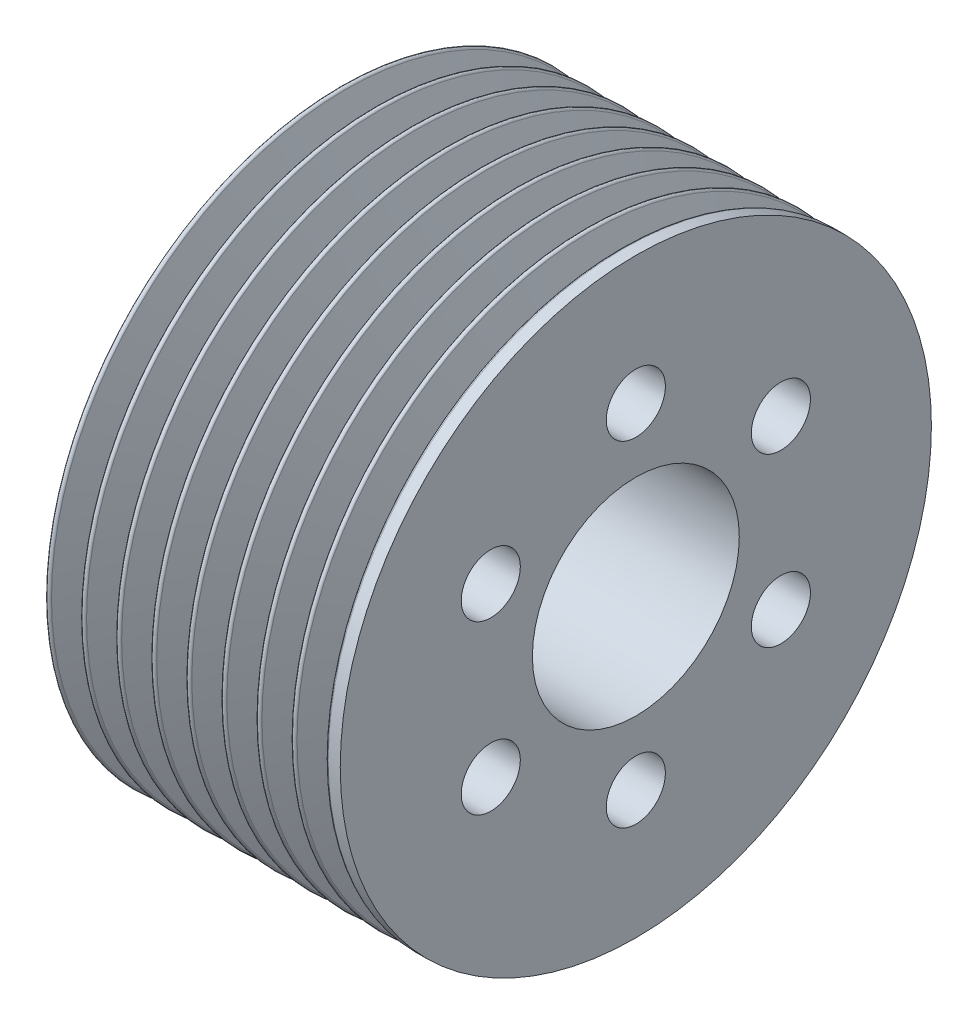
ISO-10303-21;
HEADER;
FILE_DESCRIPTION(('STEP AP214'),'2;1');
FILE_NAME('part.step','',(''),(''),'','','');
FILE_SCHEMA(('AUTOMOTIVE_DESIGN { 1 0 10303 214 1 1 1 1 }'));
ENDSEC;
DATA;
#1=APPLICATION_CONTEXT('core data for automotive mechanical design processes');
#2=APPLICATION_PROTOCOL_DEFINITION('international standard','automotive_design',2000,#1);
#3=PRODUCT_CONTEXT('',#1,'mechanical');
#4=PRODUCT('Part','Part','',(#3));
#5=PRODUCT_RELATED_PRODUCT_CATEGORY('part','',(#4));
#6=PRODUCT_DEFINITION_FORMATION('','',#4);
#7=PRODUCT_DEFINITION_CONTEXT('part definition',#1,'design');
#8=PRODUCT_DEFINITION('design','',#6,#7);
#9=PRODUCT_DEFINITION_SHAPE('','',#8);
#10=(LENGTH_UNIT() NAMED_UNIT(*) SI_UNIT(.MILLI.,.METRE.));
#11=(NAMED_UNIT(*) PLANE_ANGLE_UNIT() SI_UNIT($,.RADIAN.));
#12=(NAMED_UNIT(*) SI_UNIT($,.STERADIAN.) SOLID_ANGLE_UNIT());
#13=UNCERTAINTY_MEASURE_WITH_UNIT(LENGTH_MEASURE(1.E-05),#10,'distance_accuracy_value','');
#14=(GEOMETRIC_REPRESENTATION_CONTEXT(3) GLOBAL_UNCERTAINTY_ASSIGNED_CONTEXT((#13)) GLOBAL_UNIT_ASSIGNED_CONTEXT((#10,
#11,#12)) REPRESENTATION_CONTEXT('',''));
#15=CARTESIAN_POINT('',(0.,0.,0.));
#16=DIRECTION('',(0.,0.,1.));
#17=DIRECTION('',(1.,0.,0.));
#18=AXIS2_PLACEMENT_3D('',#15,#16,#17);
#19=CARTESIAN_POINT('',(18.,30.,0.));
#20=DIRECTION('',(1.,0.,0.));
#21=DIRECTION('',(0.,0.,-1.));
#22=AXIS2_PLACEMENT_3D('',#19,#20,#21);
#23=PLANE('',#22);
#24=CARTESIAN_POINT('',(18.,0.,0.));
#25=DIRECTION('',(-1.,0.,0.));
#26=DIRECTION('',(0.,0.,1.));
#27=AXIS2_PLACEMENT_3D('',#24,#25,#26);
#28=CIRCLE('',#27,21.5);
#29=CARTESIAN_POINT('',(18.,0.,21.5));
#30=VERTEX_POINT('',#29);
#31=EDGE_CURVE('E53',#30,#30,#28,.T.);
#32=ORIENTED_EDGE('',*,*,#31,.F.);
#33=EDGE_LOOP('',(#32));
#34=FACE_BOUND('',#33,.T.);
#35=CARTESIAN_POINT('',(18.,0.,0.));
#36=DIRECTION('',(1.,0.,0.));
#37=DIRECTION('',(0.,0.,-1.));
#38=AXIS2_PLACEMENT_3D('',#35,#36,#37);
#39=CIRCLE('',#38,26.9868547957418);
#40=CARTESIAN_POINT('',(18.,0.,-26.9868547957418));
#41=VERTEX_POINT('',#40);
#42=EDGE_CURVE('E49',#41,#41,#39,.T.);
#43=ORIENTED_EDGE('',*,*,#42,.F.);
#44=EDGE_LOOP('',(#43));
#45=FACE_BOUND('',#44,.T.);
#46=ADVANCED_FACE('F44',(#34,#45),#23,.F.);
#47=CARTESIAN_POINT('',(31.5,10.5,0.));
#48=DIRECTION('',(1.,0.,0.));
#49=DIRECTION('',(0.,0.,-1.));
#50=AXIS2_PLACEMENT_3D('',#47,#48,#49);
#51=PLANE('',#50);
#52=CARTESIAN_POINT('',(31.5,8.50000000000017,14.7224318643354));
#53=DIRECTION('',(1.,0.,0.));
#54=DIRECTION('',(0.,0.,-1.));
#55=AXIS2_PLACEMENT_3D('',#52,#53,#54);
#56=CIRCLE('',#55,3.);
#57=CARTESIAN_POINT('',(31.5,8.50000000000017,11.7224318643354));
#58=VERTEX_POINT('',#57);
#59=EDGE_CURVE('E204',#58,#58,#56,.F.);
#60=ORIENTED_EDGE('',*,*,#59,.F.);
#61=EDGE_LOOP('',(#60));
#62=FACE_BOUND('',#61,.T.);
#63=CARTESIAN_POINT('',(31.5,-8.50000000000004,14.7224318643355));
#64=DIRECTION('',(1.,0.,0.));
#65=DIRECTION('',(0.,0.,-1.));
#66=AXIS2_PLACEMENT_3D('',#63,#64,#65);
#67=CIRCLE('',#66,3.);
#68=CARTESIAN_POINT('',(31.5,-8.50000000000004,11.7224318643355));
#69=VERTEX_POINT('',#68);
#70=EDGE_CURVE('E196',#69,#69,#67,.F.);
#71=ORIENTED_EDGE('',*,*,#70,.F.);
#72=EDGE_LOOP('',(#71));
#73=FACE_BOUND('',#72,.T.);
#74=CARTESIAN_POINT('',(31.5,-17.0000000000001,0.));
#75=DIRECTION('',(1.,0.,0.));
#76=DIRECTION('',(0.,0.,-1.));
#77=AXIS2_PLACEMENT_3D('',#74,#75,#76);
#78=CIRCLE('',#77,3.);
#79=CARTESIAN_POINT('',(31.5,-17.0000000000001,-2.99999999999996));
#80=VERTEX_POINT('',#79);
#81=EDGE_CURVE('E188',#80,#80,#78,.F.);
#82=ORIENTED_EDGE('',*,*,#81,.F.);
#83=EDGE_LOOP('',(#82));
#84=FACE_BOUND('',#83,.T.);
#85=CARTESIAN_POINT('',(31.5,-8.49999999999999,-14.7224318643355));
#86=DIRECTION('',(1.,0.,0.));
#87=DIRECTION('',(0.,0.,-1.));
#88=AXIS2_PLACEMENT_3D('',#85,#86,#87);
#89=CIRCLE('',#88,3.);
#90=CARTESIAN_POINT('',(31.5,-8.49999999999999,-17.7224318643355));
#91=VERTEX_POINT('',#90);
#92=EDGE_CURVE('E182',#91,#91,#89,.F.);
#93=ORIENTED_EDGE('',*,*,#92,.F.);
#94=EDGE_LOOP('',(#93));
#95=FACE_BOUND('',#94,.T.);
#96=CARTESIAN_POINT('',(31.5,8.5,-14.7224318643355));
#97=DIRECTION('',(1.,0.,0.));
#98=DIRECTION('',(0.,0.,-1.));
#99=AXIS2_PLACEMENT_3D('',#96,#97,#98);
#100=CIRCLE('',#99,3.);
#101=CARTESIAN_POINT('',(31.5,8.5,-17.7224318643355));
#102=VERTEX_POINT('',#101);
#103=EDGE_CURVE('E176',#102,#102,#100,.F.);
#104=ORIENTED_EDGE('',*,*,#103,.F.);
#105=EDGE_LOOP('',(#104));
#106=FACE_BOUND('',#105,.T.);
#107=CARTESIAN_POINT('',(31.5,17.,0.));
#108=DIRECTION('',(1.,0.,0.));
#109=DIRECTION('',(0.,0.,-1.));
#110=AXIS2_PLACEMENT_3D('',#107,#108,#109);
#111=CIRCLE('',#110,3.);
#112=CARTESIAN_POINT('',(31.5,17.,-3.));
#113=VERTEX_POINT('',#112);
#114=EDGE_CURVE('E170',#113,#113,#111,.F.);
#115=ORIENTED_EDGE('',*,*,#114,.F.);
#116=EDGE_LOOP('',(#115));
#117=FACE_BOUND('',#116,.T.);
#118=CARTESIAN_POINT('',(31.5,0.,0.));
#119=DIRECTION('',(-1.,0.,0.));
#120=DIRECTION('',(0.,0.,1.));
#121=AXIS2_PLACEMENT_3D('',#118,#119,#120);
#122=CIRCLE('',#121,10.5);
#123=CARTESIAN_POINT('',(31.5,0.,10.5));
#124=VERTEX_POINT('',#123);
#125=EDGE_CURVE('E65',#124,#124,#122,.T.);
#126=ORIENTED_EDGE('',*,*,#125,.F.);
#127=EDGE_LOOP('',(#126));
#128=FACE_BOUND('',#127,.T.);
#129=CARTESIAN_POINT('',(31.5,0.,0.));
#130=DIRECTION('',(-1.,0.,0.));
#131=DIRECTION('',(0.,0.,1.));
#132=AXIS2_PLACEMENT_3D('',#129,#130,#131);
#133=CIRCLE('',#132,21.5);
#134=CARTESIAN_POINT('',(31.5,0.,21.5));
#135=VERTEX_POINT('',#134);
#136=EDGE_CURVE('E10',#135,#135,#133,.T.);
#137=ORIENTED_EDGE('',*,*,#136,.T.);
#138=EDGE_LOOP('',(#137));
#139=FACE_BOUND('',#138,.T.);
#140=ADVANCED_FACE('F47',(#62,#73,#84,#95,#106,#117,#128,#139),#51,.F.);
#141=CARTESIAN_POINT('',(0.,0.,0.));
#142=DIRECTION('',(-1.,0.,0.));
#143=DIRECTION('',(0.,0.,1.));
#144=AXIS2_PLACEMENT_3D('',#141,#142,#143);
#145=CYLINDRICAL_SURFACE('',#144,21.5);
#146=ORIENTED_EDGE('',*,*,#136,.F.);
#147=EDGE_LOOP('',(#146));
#148=FACE_BOUND('',#147,.T.);
#149=ORIENTED_EDGE('',*,*,#31,.T.);
#150=EDGE_LOOP('',(#149));
#151=FACE_BOUND('',#150,.T.);
#152=ADVANCED_FACE('F242',(#148,#151),#145,.F.);
#153=CARTESIAN_POINT('',(0.,0.,0.));
#154=DIRECTION('',(-1.,0.,0.));
#155=DIRECTION('',(0.,0.,1.));
#156=AXIS2_PLACEMENT_3D('',#153,#154,#155);
#157=CYLINDRICAL_SURFACE('',#156,30.);
#158=CARTESIAN_POINT('',(47.78,0.,0.));
#159=DIRECTION('',(-1.,0.,0.));
#160=DIRECTION('',(0.,0.,1.));
#161=AXIS2_PLACEMENT_3D('',#158,#159,#160);
#162=CIRCLE('',#161,30.);
#163=CARTESIAN_POINT('',(47.78,0.,30.));
#164=VERTEX_POINT('',#163);
#165=EDGE_CURVE('E80',#164,#164,#162,.T.);
#166=ORIENTED_EDGE('',*,*,#165,.F.);
#167=EDGE_LOOP('',(#166));
#168=FACE_BOUND('',#167,.T.);
#169=CARTESIAN_POINT('',(49.,0.,0.));
#170=DIRECTION('',(-1.,0.,0.));
#171=DIRECTION('',(0.,0.,1.));
#172=AXIS2_PLACEMENT_3D('',#169,#170,#171);
#173=CIRCLE('',#172,30.);
#174=CARTESIAN_POINT('',(49.,0.,30.));
#175=VERTEX_POINT('',#174);
#176=EDGE_CURVE('E57',#175,#175,#173,.T.);
#177=ORIENTED_EDGE('',*,*,#176,.T.);
#178=EDGE_LOOP('',(#177));
#179=FACE_BOUND('',#178,.T.);
#180=ADVANCED_FACE('F219',(#168,#179),#157,.T.);
#181=CARTESIAN_POINT('',(49.,10.5,0.));
#182=DIRECTION('',(-1.,0.,0.));
#183=DIRECTION('',(0.,0.,1.));
#184=AXIS2_PLACEMENT_3D('',#181,#182,#183);
#185=PLANE('',#184);
#186=CARTESIAN_POINT('',(49.,8.50000000000017,14.7224318643354));
#187=DIRECTION('',(1.,0.,0.));
#188=DIRECTION('',(0.,0.,-1.));
#189=AXIS2_PLACEMENT_3D('',#186,#187,#188);
#190=CIRCLE('',#189,3.);
#191=CARTESIAN_POINT('',(49.,8.50000000000017,11.7224318643354));
#192=VERTEX_POINT('',#191);
#193=EDGE_CURVE('E208',#192,#192,#190,.T.);
#194=ORIENTED_EDGE('',*,*,#193,.F.);
#195=EDGE_LOOP('',(#194));
#196=FACE_BOUND('',#195,.T.);
#197=CARTESIAN_POINT('',(49.,-8.50000000000004,14.7224318643355));
#198=DIRECTION('',(1.,0.,0.));
#199=DIRECTION('',(0.,0.,-1.));
#200=AXIS2_PLACEMENT_3D('',#197,#198,#199);
#201=CIRCLE('',#200,3.);
#202=CARTESIAN_POINT('',(49.,-8.50000000000004,11.7224318643355));
#203=VERTEX_POINT('',#202);
#204=EDGE_CURVE('E200',#203,#203,#201,.T.);
#205=ORIENTED_EDGE('',*,*,#204,.F.);
#206=EDGE_LOOP('',(#205));
#207=FACE_BOUND('',#206,.T.);
#208=CARTESIAN_POINT('',(49.,-17.0000000000001,0.));
#209=DIRECTION('',(1.,0.,0.));
#210=DIRECTION('',(0.,0.,-1.));
#211=AXIS2_PLACEMENT_3D('',#208,#209,#210);
#212=CIRCLE('',#211,3.);
#213=CARTESIAN_POINT('',(49.,-17.0000000000001,-2.99999999999996));
#214=VERTEX_POINT('',#213);
#215=EDGE_CURVE('E192',#214,#214,#212,.T.);
#216=ORIENTED_EDGE('',*,*,#215,.F.);
#217=EDGE_LOOP('',(#216));
#218=FACE_BOUND('',#217,.T.);
#219=CARTESIAN_POINT('',(49.,-8.49999999999999,-14.7224318643355));
#220=DIRECTION('',(1.,0.,0.));
#221=DIRECTION('',(0.,0.,-1.));
#222=AXIS2_PLACEMENT_3D('',#219,#220,#221);
#223=CIRCLE('',#222,3.);
#224=CARTESIAN_POINT('',(49.,-8.49999999999999,-17.7224318643355));
#225=VERTEX_POINT('',#224);
#226=EDGE_CURVE('E185',#225,#225,#223,.T.);
#227=ORIENTED_EDGE('',*,*,#226,.F.);
#228=EDGE_LOOP('',(#227));
#229=FACE_BOUND('',#228,.T.);
#230=CARTESIAN_POINT('',(49.,8.5,-14.7224318643355));
#231=DIRECTION('',(1.,0.,0.));
#232=DIRECTION('',(0.,0.,-1.));
#233=AXIS2_PLACEMENT_3D('',#230,#231,#232);
#234=CIRCLE('',#233,3.);
#235=CARTESIAN_POINT('',(49.,8.5,-17.7224318643355));
#236=VERTEX_POINT('',#235);
#237=EDGE_CURVE('E179',#236,#236,#234,.T.);
#238=ORIENTED_EDGE('',*,*,#237,.F.);
#239=EDGE_LOOP('',(#238));
#240=FACE_BOUND('',#239,.T.);
#241=CARTESIAN_POINT('',(49.,17.,0.));
#242=DIRECTION('',(1.,0.,0.));
#243=DIRECTION('',(0.,0.,-1.));
#244=AXIS2_PLACEMENT_3D('',#241,#242,#243);
#245=CIRCLE('',#244,3.);
#246=CARTESIAN_POINT('',(49.,17.,-3.));
#247=VERTEX_POINT('',#246);
#248=EDGE_CURVE('E173',#247,#247,#245,.T.);
#249=ORIENTED_EDGE('',*,*,#248,.F.);
#250=EDGE_LOOP('',(#249));
#251=FACE_BOUND('',#250,.T.);
#252=ORIENTED_EDGE('',*,*,#176,.F.);
#253=EDGE_LOOP('',(#252));
#254=FACE_BOUND('',#253,.T.);
#255=CARTESIAN_POINT('',(49.,0.,0.));
#256=DIRECTION('',(-1.,0.,0.));
#257=DIRECTION('',(0.,0.,1.));
#258=AXIS2_PLACEMENT_3D('',#255,#256,#257);
#259=CIRCLE('',#258,10.5);
#260=CARTESIAN_POINT('',(49.,0.,10.5));
#261=VERTEX_POINT('',#260);
#262=EDGE_CURVE('E62',#261,#261,#259,.T.);
#263=ORIENTED_EDGE('',*,*,#262,.T.);
#264=EDGE_LOOP('',(#263));
#265=FACE_BOUND('',#264,.T.);
#266=ADVANCED_FACE('F215',(#196,#207,#218,#229,#240,#251,#254,#265),#185,.F.);
#267=CARTESIAN_POINT('',(0.,0.,0.));
#268=DIRECTION('',(-1.,0.,0.));
#269=DIRECTION('',(0.,0.,1.));
#270=AXIS2_PLACEMENT_3D('',#267,#268,#269);
#271=CYLINDRICAL_SURFACE('',#270,10.5);
#272=ORIENTED_EDGE('',*,*,#262,.F.);
#273=EDGE_LOOP('',(#272));
#274=FACE_BOUND('',#273,.T.);
#275=ORIENTED_EDGE('',*,*,#125,.T.);
#276=EDGE_LOOP('',(#275));
#277=FACE_BOUND('',#276,.T.);
#278=ADVANCED_FACE('F218',(#274,#277),#271,.F.);
#279=CARTESIAN_POINT('',(47.78,0.,0.));
#280=DIRECTION('',(-1.,0.,0.));
#281=DIRECTION('',(0.,0.,1.));
#282=AXIS2_PLACEMENT_3D('',#279,#280,#281);
#283=TOROIDAL_SURFACE('',#282,29.75,0.249999999999997);
#284=ORIENTED_EDGE('',*,*,#165,.T.);
#285=EDGE_LOOP('',(#284));
#286=FACE_BOUND('',#285,.T.);
#287=CARTESIAN_POINT('',(47.5458319526879,0.,0.));
#288=DIRECTION('',(-1.,0.,0.));
#289=DIRECTION('',(0.,0.,1.));
#290=AXIS2_PLACEMENT_3D('',#287,#288,#289);
#291=CIRCLE('',#290,29.8375518453149);
#292=CARTESIAN_POINT('',(47.5458319526879,0.,29.8375518453149));
#293=VERTEX_POINT('',#292);
#294=EDGE_CURVE('E68',#293,#293,#291,.T.);
#295=ORIENTED_EDGE('',*,*,#294,.F.);
#296=EDGE_LOOP('',(#295));
#297=FACE_BOUND('',#296,.T.);
#298=ADVANCED_FACE('F237',(#286,#297),#283,.T.);
#299=CARTESIAN_POINT('',(46.2810016567745,0.,0.));
#300=DIRECTION('',(1.,0.,0.));
#301=DIRECTION('',(0.,0.,-1.));
#302=AXIS2_PLACEMENT_3D('',#299,#300,#301);
#303=CONICAL_SURFACE('',#302,26.4546095496951,1.21300383013606);
#304=ORIENTED_EDGE('',*,*,#294,.T.);
#305=EDGE_LOOP('',(#304));
#306=FACE_BOUND('',#305,.T.);
#307=CARTESIAN_POINT('',(46.2810016567745,0.,0.));
#308=DIRECTION('',(-1.,0.,0.));
#309=DIRECTION('',(0.,0.,1.));
#310=AXIS2_PLACEMENT_3D('',#307,#308,#309);
#311=CIRCLE('',#310,26.4546095496951);
#312=CARTESIAN_POINT('',(46.2810016567745,0.,26.4546095496951));
#313=VERTEX_POINT('',#312);
#314=EDGE_CURVE('E71',#313,#313,#311,.T.);
#315=ORIENTED_EDGE('',*,*,#314,.F.);
#316=EDGE_LOOP('',(#315));
#317=FACE_BOUND('',#316,.T.);
#318=ADVANCED_FACE('F403',(#306,#317),#303,.T.);
#319=CARTESIAN_POINT('',(46.,0.,0.));
#320=DIRECTION('',(-1.,0.,0.));
#321=DIRECTION('',(0.,0.,1.));
#322=AXIS2_PLACEMENT_3D('',#319,#320,#321);
#323=TOROIDAL_SURFACE('',#322,26.5596717640729,0.300000000000001);
#324=ORIENTED_EDGE('',*,*,#314,.T.);
#325=EDGE_LOOP('',(#324));
#326=FACE_BOUND('',#325,.T.);
#327=CARTESIAN_POINT('',(45.7189983432255,0.,0.));
#328=DIRECTION('',(-1.,0.,0.));
#329=DIRECTION('',(0.,0.,1.));
#330=AXIS2_PLACEMENT_3D('',#327,#328,#329);
#331=CIRCLE('',#330,26.4546095496951);
#332=CARTESIAN_POINT('',(45.7189983432255,0.,26.4546095496951));
#333=VERTEX_POINT('',#332);
#334=EDGE_CURVE('E74',#333,#333,#331,.T.);
#335=ORIENTED_EDGE('',*,*,#334,.F.);
#336=EDGE_LOOP('',(#335));
#337=FACE_BOUND('',#336,.T.);
#338=ADVANCED_FACE('F399',(#326,#337),#323,.F.);
#339=CARTESIAN_POINT('',(44.4541680473121,0.,0.));
#340=DIRECTION('',(-1.,0.,0.));
#341=DIRECTION('',(0.,0.,1.));
#342=AXIS2_PLACEMENT_3D('',#339,#340,#341);
#343=CONICAL_SURFACE('',#342,29.8375518453149,1.21300383013606);
#344=ORIENTED_EDGE('',*,*,#334,.T.);
#345=EDGE_LOOP('',(#344));
#346=FACE_BOUND('',#345,.T.);
#347=CARTESIAN_POINT('',(44.4541680473121,0.,0.));
#348=DIRECTION('',(-1.,0.,0.));
#349=DIRECTION('',(0.,0.,1.));
#350=AXIS2_PLACEMENT_3D('',#347,#348,#349);
#351=CIRCLE('',#350,29.8375518453149);
#352=CARTESIAN_POINT('',(44.4541680473121,0.,29.8375518453149));
#353=VERTEX_POINT('',#352);
#354=EDGE_CURVE('E77',#353,#353,#351,.T.);
#355=ORIENTED_EDGE('',*,*,#354,.F.);
#356=EDGE_LOOP('',(#355));
#357=FACE_BOUND('',#356,.T.);
#358=ADVANCED_FACE('F395',(#346,#357),#343,.T.);
#359=CARTESIAN_POINT('',(44.22,0.,0.));
#360=DIRECTION('',(-1.,0.,0.));
#361=DIRECTION('',(0.,0.,1.));
#362=AXIS2_PLACEMENT_3D('',#359,#360,#361);
#363=TOROIDAL_SURFACE('',#362,29.75,0.250000000000004);
#364=ORIENTED_EDGE('',*,*,#354,.T.);
#365=EDGE_LOOP('',(#364));
#366=FACE_BOUND('',#365,.T.);
#367=CARTESIAN_POINT('',(43.9858319526879,0.,0.));
#368=DIRECTION('',(-1.,0.,0.));
#369=DIRECTION('',(0.,0.,1.));
#370=AXIS2_PLACEMENT_3D('',#367,#368,#369);
#371=CIRCLE('',#370,29.8375518453149);
#372=CARTESIAN_POINT('',(43.9858319526879,0.,29.8375518453149));
#373=VERTEX_POINT('',#372);
#374=EDGE_CURVE('E83',#373,#373,#371,.T.);
#375=ORIENTED_EDGE('',*,*,#374,.F.);
#376=EDGE_LOOP('',(#375));
#377=FACE_BOUND('',#376,.T.);
#378=ADVANCED_FACE('F391',(#366,#377),#363,.T.);
#379=CARTESIAN_POINT('',(42.7210016567745,0.,0.));
#380=DIRECTION('',(1.,0.,0.));
#381=DIRECTION('',(0.,0.,-1.));
#382=AXIS2_PLACEMENT_3D('',#379,#380,#381);
#383=CONICAL_SURFACE('',#382,26.4546095496951,1.21300383013606);
#384=ORIENTED_EDGE('',*,*,#374,.T.);
#385=EDGE_LOOP('',(#384));
#386=FACE_BOUND('',#385,.T.);
#387=CARTESIAN_POINT('',(42.7210016567745,0.,0.));
#388=DIRECTION('',(-1.,0.,0.));
#389=DIRECTION('',(0.,0.,1.));
#390=AXIS2_PLACEMENT_3D('',#387,#388,#389);
#391=CIRCLE('',#390,26.4546095496951);
#392=CARTESIAN_POINT('',(42.7210016567745,0.,26.4546095496951));
#393=VERTEX_POINT('',#392);
#394=EDGE_CURVE('E86',#393,#393,#391,.T.);
#395=ORIENTED_EDGE('',*,*,#394,.F.);
#396=EDGE_LOOP('',(#395));
#397=FACE_BOUND('',#396,.T.);
#398=ADVANCED_FACE('F387',(#386,#397),#383,.T.);
#399=CARTESIAN_POINT('',(42.44,0.,0.));
#400=DIRECTION('',(-1.,0.,0.));
#401=DIRECTION('',(0.,0.,1.));
#402=AXIS2_PLACEMENT_3D('',#399,#400,#401);
#403=TOROIDAL_SURFACE('',#402,26.5596717640729,0.300000000000001);
#404=ORIENTED_EDGE('',*,*,#394,.T.);
#405=EDGE_LOOP('',(#404));
#406=FACE_BOUND('',#405,.T.);
#407=CARTESIAN_POINT('',(42.1589983432255,0.,0.));
#408=DIRECTION('',(-1.,0.,0.));
#409=DIRECTION('',(0.,0.,1.));
#410=AXIS2_PLACEMENT_3D('',#407,#408,#409);
#411=CIRCLE('',#410,26.4546095496951);
#412=CARTESIAN_POINT('',(42.1589983432255,0.,26.4546095496951));
#413=VERTEX_POINT('',#412);
#414=EDGE_CURVE('E89',#413,#413,#411,.T.);
#415=ORIENTED_EDGE('',*,*,#414,.F.);
#416=EDGE_LOOP('',(#415));
#417=FACE_BOUND('',#416,.T.);
#418=ADVANCED_FACE('F383',(#406,#417),#403,.F.);
#419=CARTESIAN_POINT('',(40.8941680473121,0.,0.));
#420=DIRECTION('',(-1.,0.,0.));
#421=DIRECTION('',(0.,0.,1.));
#422=AXIS2_PLACEMENT_3D('',#419,#420,#421);
#423=CONICAL_SURFACE('',#422,29.8375518453149,1.21300383013606);
#424=ORIENTED_EDGE('',*,*,#414,.T.);
#425=EDGE_LOOP('',(#424));
#426=FACE_BOUND('',#425,.T.);
#427=CARTESIAN_POINT('',(40.8941680473121,0.,0.));
#428=DIRECTION('',(-1.,0.,0.));
#429=DIRECTION('',(0.,0.,1.));
#430=AXIS2_PLACEMENT_3D('',#427,#428,#429);
#431=CIRCLE('',#430,29.8375518453149);
#432=CARTESIAN_POINT('',(40.8941680473121,0.,29.8375518453149));
#433=VERTEX_POINT('',#432);
#434=EDGE_CURVE('E92',#433,#433,#431,.T.);
#435=ORIENTED_EDGE('',*,*,#434,.F.);
#436=EDGE_LOOP('',(#435));
#437=FACE_BOUND('',#436,.T.);
#438=ADVANCED_FACE('F379',(#426,#437),#423,.T.);
#439=CARTESIAN_POINT('',(40.66,0.,0.));
#440=DIRECTION('',(-1.,0.,0.));
#441=DIRECTION('',(0.,0.,1.));
#442=AXIS2_PLACEMENT_3D('',#439,#440,#441);
#443=TOROIDAL_SURFACE('',#442,29.75,0.250000000000004);
#444=ORIENTED_EDGE('',*,*,#434,.T.);
#445=EDGE_LOOP('',(#444));
#446=FACE_BOUND('',#445,.T.);
#447=CARTESIAN_POINT('',(40.4258319526879,0.,0.));
#448=DIRECTION('',(-1.,0.,0.));
#449=DIRECTION('',(0.,0.,1.));
#450=AXIS2_PLACEMENT_3D('',#447,#448,#449);
#451=CIRCLE('',#450,29.8375518453149);
#452=CARTESIAN_POINT('',(40.4258319526879,0.,29.8375518453149));
#453=VERTEX_POINT('',#452);
#454=EDGE_CURVE('E95',#453,#453,#451,.T.);
#455=ORIENTED_EDGE('',*,*,#454,.F.);
#456=EDGE_LOOP('',(#455));
#457=FACE_BOUND('',#456,.T.);
#458=ADVANCED_FACE('F375',(#446,#457),#443,.T.);
#459=CARTESIAN_POINT('',(39.1610016567745,0.,0.));
#460=DIRECTION('',(1.,0.,0.));
#461=DIRECTION('',(0.,0.,-1.));
#462=AXIS2_PLACEMENT_3D('',#459,#460,#461);
#463=CONICAL_SURFACE('',#462,26.4546095496951,1.21300383013606);
#464=ORIENTED_EDGE('',*,*,#454,.T.);
#465=EDGE_LOOP('',(#464));
#466=FACE_BOUND('',#465,.T.);
#467=CARTESIAN_POINT('',(39.1610016567745,0.,0.));
#468=DIRECTION('',(-1.,0.,0.));
#469=DIRECTION('',(0.,0.,1.));
#470=AXIS2_PLACEMENT_3D('',#467,#468,#469);
#471=CIRCLE('',#470,26.4546095496951);
#472=CARTESIAN_POINT('',(39.1610016567745,0.,26.4546095496951));
#473=VERTEX_POINT('',#472);
#474=EDGE_CURVE('E98',#473,#473,#471,.T.);
#475=ORIENTED_EDGE('',*,*,#474,.F.);
#476=EDGE_LOOP('',(#475));
#477=FACE_BOUND('',#476,.T.);
#478=ADVANCED_FACE('F371',(#466,#477),#463,.T.);
#479=CARTESIAN_POINT('',(38.88,0.,0.));
#480=DIRECTION('',(-1.,0.,0.));
#481=DIRECTION('',(0.,0.,1.));
#482=AXIS2_PLACEMENT_3D('',#479,#480,#481);
#483=TOROIDAL_SURFACE('',#482,26.5596717640729,0.300000000000001);
#484=ORIENTED_EDGE('',*,*,#474,.T.);
#485=EDGE_LOOP('',(#484));
#486=FACE_BOUND('',#485,.T.);
#487=CARTESIAN_POINT('',(38.5989983432255,0.,0.));
#488=DIRECTION('',(-1.,0.,0.));
#489=DIRECTION('',(0.,0.,1.));
#490=AXIS2_PLACEMENT_3D('',#487,#488,#489);
#491=CIRCLE('',#490,26.4546095496951);
#492=CARTESIAN_POINT('',(38.5989983432255,0.,26.4546095496951));
#493=VERTEX_POINT('',#492);
#494=EDGE_CURVE('E101',#493,#493,#491,.T.);
#495=ORIENTED_EDGE('',*,*,#494,.F.);
#496=EDGE_LOOP('',(#495));
#497=FACE_BOUND('',#496,.T.);
#498=ADVANCED_FACE('F367',(#486,#497),#483,.F.);
#499=CARTESIAN_POINT('',(37.3341680473121,0.,0.));
#500=DIRECTION('',(-1.,0.,0.));
#501=DIRECTION('',(0.,0.,1.));
#502=AXIS2_PLACEMENT_3D('',#499,#500,#501);
#503=CONICAL_SURFACE('',#502,29.8375518453149,1.21300383013606);
#504=ORIENTED_EDGE('',*,*,#494,.T.);
#505=EDGE_LOOP('',(#504));
#506=FACE_BOUND('',#505,.T.);
#507=CARTESIAN_POINT('',(37.3341680473121,0.,0.));
#508=DIRECTION('',(-1.,0.,0.));
#509=DIRECTION('',(0.,0.,1.));
#510=AXIS2_PLACEMENT_3D('',#507,#508,#509);
#511=CIRCLE('',#510,29.8375518453149);
#512=CARTESIAN_POINT('',(37.3341680473121,0.,29.8375518453149));
#513=VERTEX_POINT('',#512);
#514=EDGE_CURVE('E104',#513,#513,#511,.T.);
#515=ORIENTED_EDGE('',*,*,#514,.F.);
#516=EDGE_LOOP('',(#515));
#517=FACE_BOUND('',#516,.T.);
#518=ADVANCED_FACE('F363',(#506,#517),#503,.T.);
#519=CARTESIAN_POINT('',(37.1,0.,0.));
#520=DIRECTION('',(-1.,0.,0.));
#521=DIRECTION('',(0.,0.,1.));
#522=AXIS2_PLACEMENT_3D('',#519,#520,#521);
#523=TOROIDAL_SURFACE('',#522,29.75,0.250000000000004);
#524=ORIENTED_EDGE('',*,*,#514,.T.);
#525=EDGE_LOOP('',(#524));
#526=FACE_BOUND('',#525,.T.);
#527=CARTESIAN_POINT('',(36.8658319526879,0.,0.));
#528=DIRECTION('',(-1.,0.,0.));
#529=DIRECTION('',(0.,0.,1.));
#530=AXIS2_PLACEMENT_3D('',#527,#528,#529);
#531=CIRCLE('',#530,29.8375518453149);
#532=CARTESIAN_POINT('',(36.8658319526879,0.,29.8375518453149));
#533=VERTEX_POINT('',#532);
#534=EDGE_CURVE('E107',#533,#533,#531,.T.);
#535=ORIENTED_EDGE('',*,*,#534,.F.);
#536=EDGE_LOOP('',(#535));
#537=FACE_BOUND('',#536,.T.);
#538=ADVANCED_FACE('F359',(#526,#537),#523,.T.);
#539=CARTESIAN_POINT('',(35.6010016567745,0.,0.));
#540=DIRECTION('',(1.,0.,0.));
#541=DIRECTION('',(0.,0.,-1.));
#542=AXIS2_PLACEMENT_3D('',#539,#540,#541);
#543=CONICAL_SURFACE('',#542,26.4546095496951,1.21300383013606);
#544=ORIENTED_EDGE('',*,*,#534,.T.);
#545=EDGE_LOOP('',(#544));
#546=FACE_BOUND('',#545,.T.);
#547=CARTESIAN_POINT('',(35.6010016567745,0.,0.));
#548=DIRECTION('',(-1.,0.,0.));
#549=DIRECTION('',(0.,0.,1.));
#550=AXIS2_PLACEMENT_3D('',#547,#548,#549);
#551=CIRCLE('',#550,26.4546095496951);
#552=CARTESIAN_POINT('',(35.6010016567745,0.,26.4546095496951));
#553=VERTEX_POINT('',#552);
#554=EDGE_CURVE('E110',#553,#553,#551,.T.);
#555=ORIENTED_EDGE('',*,*,#554,.F.);
#556=EDGE_LOOP('',(#555));
#557=FACE_BOUND('',#556,.T.);
#558=ADVANCED_FACE('F355',(#546,#557),#543,.T.);
#559=CARTESIAN_POINT('',(35.32,0.,0.));
#560=DIRECTION('',(-1.,0.,0.));
#561=DIRECTION('',(0.,0.,1.));
#562=AXIS2_PLACEMENT_3D('',#559,#560,#561);
#563=TOROIDAL_SURFACE('',#562,26.5596717640729,0.300000000000001);
#564=ORIENTED_EDGE('',*,*,#554,.T.);
#565=EDGE_LOOP('',(#564));
#566=FACE_BOUND('',#565,.T.);
#567=CARTESIAN_POINT('',(35.0389983432255,0.,0.));
#568=DIRECTION('',(-1.,0.,0.));
#569=DIRECTION('',(0.,0.,1.));
#570=AXIS2_PLACEMENT_3D('',#567,#568,#569);
#571=CIRCLE('',#570,26.4546095496951);
#572=CARTESIAN_POINT('',(35.0389983432255,0.,26.4546095496951));
#573=VERTEX_POINT('',#572);
#574=EDGE_CURVE('E113',#573,#573,#571,.T.);
#575=ORIENTED_EDGE('',*,*,#574,.F.);
#576=EDGE_LOOP('',(#575));
#577=FACE_BOUND('',#576,.T.);
#578=ADVANCED_FACE('F351',(#566,#577),#563,.F.);
#579=CARTESIAN_POINT('',(33.7741680473121,0.,0.));
#580=DIRECTION('',(-1.,0.,0.));
#581=DIRECTION('',(0.,0.,1.));
#582=AXIS2_PLACEMENT_3D('',#579,#580,#581);
#583=CONICAL_SURFACE('',#582,29.8375518453149,1.21300383013606);
#584=ORIENTED_EDGE('',*,*,#574,.T.);
#585=EDGE_LOOP('',(#584));
#586=FACE_BOUND('',#585,.T.);
#587=CARTESIAN_POINT('',(33.7741680473121,0.,0.));
#588=DIRECTION('',(-1.,0.,0.));
#589=DIRECTION('',(0.,0.,1.));
#590=AXIS2_PLACEMENT_3D('',#587,#588,#589);
#591=CIRCLE('',#590,29.8375518453149);
#592=CARTESIAN_POINT('',(33.7741680473121,0.,29.8375518453149));
#593=VERTEX_POINT('',#592);
#594=EDGE_CURVE('E116',#593,#593,#591,.T.);
#595=ORIENTED_EDGE('',*,*,#594,.F.);
#596=EDGE_LOOP('',(#595));
#597=FACE_BOUND('',#596,.T.);
#598=ADVANCED_FACE('F347',(#586,#597),#583,.T.);
#599=CARTESIAN_POINT('',(33.54,0.,0.));
#600=DIRECTION('',(-1.,0.,0.));
#601=DIRECTION('',(0.,0.,1.));
#602=AXIS2_PLACEMENT_3D('',#599,#600,#601);
#603=TOROIDAL_SURFACE('',#602,29.75,0.250000000000004);
#604=ORIENTED_EDGE('',*,*,#594,.T.);
#605=EDGE_LOOP('',(#604));
#606=FACE_BOUND('',#605,.T.);
#607=CARTESIAN_POINT('',(33.3058319526879,0.,0.));
#608=DIRECTION('',(-1.,0.,0.));
#609=DIRECTION('',(0.,0.,1.));
#610=AXIS2_PLACEMENT_3D('',#607,#608,#609);
#611=CIRCLE('',#610,29.8375518453149);
#612=CARTESIAN_POINT('',(33.3058319526879,0.,29.8375518453149));
#613=VERTEX_POINT('',#612);
#614=EDGE_CURVE('E119',#613,#613,#611,.T.);
#615=ORIENTED_EDGE('',*,*,#614,.F.);
#616=EDGE_LOOP('',(#615));
#617=FACE_BOUND('',#616,.T.);
#618=ADVANCED_FACE('F343',(#606,#617),#603,.T.);
#619=CARTESIAN_POINT('',(32.0410016567745,0.,0.));
#620=DIRECTION('',(1.,0.,0.));
#621=DIRECTION('',(0.,0.,-1.));
#622=AXIS2_PLACEMENT_3D('',#619,#620,#621);
#623=CONICAL_SURFACE('',#622,26.4546095496951,1.21300383013606);
#624=ORIENTED_EDGE('',*,*,#614,.T.);
#625=EDGE_LOOP('',(#624));
#626=FACE_BOUND('',#625,.T.);
#627=CARTESIAN_POINT('',(32.0410016567745,0.,0.));
#628=DIRECTION('',(-1.,0.,0.));
#629=DIRECTION('',(0.,0.,1.));
#630=AXIS2_PLACEMENT_3D('',#627,#628,#629);
#631=CIRCLE('',#630,26.4546095496951);
#632=CARTESIAN_POINT('',(32.0410016567745,0.,26.4546095496951));
#633=VERTEX_POINT('',#632);
#634=EDGE_CURVE('E122',#633,#633,#631,.T.);
#635=ORIENTED_EDGE('',*,*,#634,.F.);
#636=EDGE_LOOP('',(#635));
#637=FACE_BOUND('',#636,.T.);
#638=ADVANCED_FACE('F339',(#626,#637),#623,.T.);
#639=CARTESIAN_POINT('',(31.76,0.,0.));
#640=DIRECTION('',(-1.,0.,0.));
#641=DIRECTION('',(0.,0.,1.));
#642=AXIS2_PLACEMENT_3D('',#639,#640,#641);
#643=TOROIDAL_SURFACE('',#642,26.5596717640729,0.300000000000001);
#644=ORIENTED_EDGE('',*,*,#634,.T.);
#645=EDGE_LOOP('',(#644));
#646=FACE_BOUND('',#645,.T.);
#647=CARTESIAN_POINT('',(31.4789983432255,0.,0.));
#648=DIRECTION('',(-1.,0.,0.));
#649=DIRECTION('',(0.,0.,1.));
#650=AXIS2_PLACEMENT_3D('',#647,#648,#649);
#651=CIRCLE('',#650,26.4546095496951);
#652=CARTESIAN_POINT('',(31.4789983432255,0.,26.4546095496951));
#653=VERTEX_POINT('',#652);
#654=EDGE_CURVE('E125',#653,#653,#651,.T.);
#655=ORIENTED_EDGE('',*,*,#654,.F.);
#656=EDGE_LOOP('',(#655));
#657=FACE_BOUND('',#656,.T.);
#658=ADVANCED_FACE('F335',(#646,#657),#643,.F.);
#659=CARTESIAN_POINT('',(30.2141680473121,0.,0.));
#660=DIRECTION('',(-1.,0.,0.));
#661=DIRECTION('',(0.,0.,1.));
#662=AXIS2_PLACEMENT_3D('',#659,#660,#661);
#663=CONICAL_SURFACE('',#662,29.8375518453149,1.21300383013606);
#664=ORIENTED_EDGE('',*,*,#654,.T.);
#665=EDGE_LOOP('',(#664));
#666=FACE_BOUND('',#665,.T.);
#667=CARTESIAN_POINT('',(30.2141680473121,0.,0.));
#668=DIRECTION('',(-1.,0.,0.));
#669=DIRECTION('',(0.,0.,1.));
#670=AXIS2_PLACEMENT_3D('',#667,#668,#669);
#671=CIRCLE('',#670,29.8375518453149);
#672=CARTESIAN_POINT('',(30.2141680473121,0.,29.8375518453149));
#673=VERTEX_POINT('',#672);
#674=EDGE_CURVE('E128',#673,#673,#671,.T.);
#675=ORIENTED_EDGE('',*,*,#674,.F.);
#676=EDGE_LOOP('',(#675));
#677=FACE_BOUND('',#676,.T.);
#678=ADVANCED_FACE('F331',(#666,#677),#663,.T.);
#679=CARTESIAN_POINT('',(29.98,0.,0.));
#680=DIRECTION('',(-1.,0.,0.));
#681=DIRECTION('',(0.,0.,1.));
#682=AXIS2_PLACEMENT_3D('',#679,#680,#681);
#683=TOROIDAL_SURFACE('',#682,29.75,0.250000000000004);
#684=ORIENTED_EDGE('',*,*,#674,.T.);
#685=EDGE_LOOP('',(#684));
#686=FACE_BOUND('',#685,.T.);
#687=CARTESIAN_POINT('',(29.7458319526879,0.,0.));
#688=DIRECTION('',(-1.,0.,0.));
#689=DIRECTION('',(0.,0.,1.));
#690=AXIS2_PLACEMENT_3D('',#687,#688,#689);
#691=CIRCLE('',#690,29.8375518453149);
#692=CARTESIAN_POINT('',(29.7458319526879,0.,29.8375518453149));
#693=VERTEX_POINT('',#692);
#694=EDGE_CURVE('E131',#693,#693,#691,.T.);
#695=ORIENTED_EDGE('',*,*,#694,.F.);
#696=EDGE_LOOP('',(#695));
#697=FACE_BOUND('',#696,.T.);
#698=ADVANCED_FACE('F327',(#686,#697),#683,.T.);
#699=CARTESIAN_POINT('',(28.4810016567745,0.,0.));
#700=DIRECTION('',(1.,0.,0.));
#701=DIRECTION('',(0.,0.,-1.));
#702=AXIS2_PLACEMENT_3D('',#699,#700,#701);
#703=CONICAL_SURFACE('',#702,26.4546095496951,1.21300383013606);
#704=ORIENTED_EDGE('',*,*,#694,.T.);
#705=EDGE_LOOP('',(#704));
#706=FACE_BOUND('',#705,.T.);
#707=CARTESIAN_POINT('',(28.4810016567745,0.,0.));
#708=DIRECTION('',(-1.,0.,0.));
#709=DIRECTION('',(0.,0.,1.));
#710=AXIS2_PLACEMENT_3D('',#707,#708,#709);
#711=CIRCLE('',#710,26.4546095496951);
#712=CARTESIAN_POINT('',(28.4810016567745,0.,26.4546095496951));
#713=VERTEX_POINT('',#712);
#714=EDGE_CURVE('E134',#713,#713,#711,.T.);
#715=ORIENTED_EDGE('',*,*,#714,.F.);
#716=EDGE_LOOP('',(#715));
#717=FACE_BOUND('',#716,.T.);
#718=ADVANCED_FACE('F323',(#706,#717),#703,.T.);
#719=CARTESIAN_POINT('',(28.2,0.,0.));
#720=DIRECTION('',(-1.,0.,0.));
#721=DIRECTION('',(0.,0.,1.));
#722=AXIS2_PLACEMENT_3D('',#719,#720,#721);
#723=TOROIDAL_SURFACE('',#722,26.5596717640729,0.300000000000001);
#724=ORIENTED_EDGE('',*,*,#714,.T.);
#725=EDGE_LOOP('',(#724));
#726=FACE_BOUND('',#725,.T.);
#727=CARTESIAN_POINT('',(27.9189983432255,0.,0.));
#728=DIRECTION('',(-1.,0.,0.));
#729=DIRECTION('',(0.,0.,1.));
#730=AXIS2_PLACEMENT_3D('',#727,#728,#729);
#731=CIRCLE('',#730,26.4546095496951);
#732=CARTESIAN_POINT('',(27.9189983432255,0.,26.4546095496951));
#733=VERTEX_POINT('',#732);
#734=EDGE_CURVE('E137',#733,#733,#731,.T.);
#735=ORIENTED_EDGE('',*,*,#734,.F.);
#736=EDGE_LOOP('',(#735));
#737=FACE_BOUND('',#736,.T.);
#738=ADVANCED_FACE('F319',(#726,#737),#723,.F.);
#739=CARTESIAN_POINT('',(26.6541680473121,0.,0.));
#740=DIRECTION('',(-1.,0.,0.));
#741=DIRECTION('',(0.,0.,1.));
#742=AXIS2_PLACEMENT_3D('',#739,#740,#741);
#743=CONICAL_SURFACE('',#742,29.8375518453149,1.21300383013606);
#744=ORIENTED_EDGE('',*,*,#734,.T.);
#745=EDGE_LOOP('',(#744));
#746=FACE_BOUND('',#745,.T.);
#747=CARTESIAN_POINT('',(26.6541680473121,0.,0.));
#748=DIRECTION('',(-1.,0.,0.));
#749=DIRECTION('',(0.,0.,1.));
#750=AXIS2_PLACEMENT_3D('',#747,#748,#749);
#751=CIRCLE('',#750,29.8375518453149);
#752=CARTESIAN_POINT('',(26.6541680473121,0.,29.8375518453149));
#753=VERTEX_POINT('',#752);
#754=EDGE_CURVE('E140',#753,#753,#751,.T.);
#755=ORIENTED_EDGE('',*,*,#754,.F.);
#756=EDGE_LOOP('',(#755));
#757=FACE_BOUND('',#756,.T.);
#758=ADVANCED_FACE('F315',(#746,#757),#743,.T.);
#759=CARTESIAN_POINT('',(26.42,0.,0.));
#760=DIRECTION('',(-1.,0.,0.));
#761=DIRECTION('',(0.,0.,1.));
#762=AXIS2_PLACEMENT_3D('',#759,#760,#761);
#763=TOROIDAL_SURFACE('',#762,29.75,0.250000000000004);
#764=ORIENTED_EDGE('',*,*,#754,.T.);
#765=EDGE_LOOP('',(#764));
#766=FACE_BOUND('',#765,.T.);
#767=CARTESIAN_POINT('',(26.1858319526879,0.,0.));
#768=DIRECTION('',(-1.,0.,0.));
#769=DIRECTION('',(0.,0.,1.));
#770=AXIS2_PLACEMENT_3D('',#767,#768,#769);
#771=CIRCLE('',#770,29.8375518453149);
#772=CARTESIAN_POINT('',(26.1858319526879,0.,29.8375518453149));
#773=VERTEX_POINT('',#772);
#774=EDGE_CURVE('E143',#773,#773,#771,.T.);
#775=ORIENTED_EDGE('',*,*,#774,.F.);
#776=EDGE_LOOP('',(#775));
#777=FACE_BOUND('',#776,.T.);
#778=ADVANCED_FACE('F311',(#766,#777),#763,.T.);
#779=CARTESIAN_POINT('',(24.9210016567745,0.,0.));
#780=DIRECTION('',(1.,0.,0.));
#781=DIRECTION('',(0.,0.,-1.));
#782=AXIS2_PLACEMENT_3D('',#779,#780,#781);
#783=CONICAL_SURFACE('',#782,26.4546095496951,1.21300383013606);
#784=ORIENTED_EDGE('',*,*,#774,.T.);
#785=EDGE_LOOP('',(#784));
#786=FACE_BOUND('',#785,.T.);
#787=CARTESIAN_POINT('',(24.9210016567745,0.,0.));
#788=DIRECTION('',(-1.,0.,0.));
#789=DIRECTION('',(0.,0.,1.));
#790=AXIS2_PLACEMENT_3D('',#787,#788,#789);
#791=CIRCLE('',#790,26.4546095496951);
#792=CARTESIAN_POINT('',(24.9210016567745,0.,26.4546095496951));
#793=VERTEX_POINT('',#792);
#794=EDGE_CURVE('E146',#793,#793,#791,.T.);
#795=ORIENTED_EDGE('',*,*,#794,.F.);
#796=EDGE_LOOP('',(#795));
#797=FACE_BOUND('',#796,.T.);
#798=ADVANCED_FACE('F307',(#786,#797),#783,.T.);
#799=CARTESIAN_POINT('',(24.64,0.,0.));
#800=DIRECTION('',(-1.,0.,0.));
#801=DIRECTION('',(0.,0.,1.));
#802=AXIS2_PLACEMENT_3D('',#799,#800,#801);
#803=TOROIDAL_SURFACE('',#802,26.5596717640729,0.300000000000001);
#804=ORIENTED_EDGE('',*,*,#794,.T.);
#805=EDGE_LOOP('',(#804));
#806=FACE_BOUND('',#805,.T.);
#807=CARTESIAN_POINT('',(24.3589983432255,0.,0.));
#808=DIRECTION('',(-1.,0.,0.));
#809=DIRECTION('',(0.,0.,1.));
#810=AXIS2_PLACEMENT_3D('',#807,#808,#809);
#811=CIRCLE('',#810,26.4546095496951);
#812=CARTESIAN_POINT('',(24.3589983432255,0.,26.4546095496951));
#813=VERTEX_POINT('',#812);
#814=EDGE_CURVE('E149',#813,#813,#811,.T.);
#815=ORIENTED_EDGE('',*,*,#814,.F.);
#816=EDGE_LOOP('',(#815));
#817=FACE_BOUND('',#816,.T.);
#818=ADVANCED_FACE('F303',(#806,#817),#803,.F.);
#819=CARTESIAN_POINT('',(23.0941680473121,0.,0.));
#820=DIRECTION('',(-1.,0.,0.));
#821=DIRECTION('',(0.,0.,1.));
#822=AXIS2_PLACEMENT_3D('',#819,#820,#821);
#823=CONICAL_SURFACE('',#822,29.8375518453149,1.21300383013606);
#824=ORIENTED_EDGE('',*,*,#814,.T.);
#825=EDGE_LOOP('',(#824));
#826=FACE_BOUND('',#825,.T.);
#827=CARTESIAN_POINT('',(23.0941680473121,0.,0.));
#828=DIRECTION('',(-1.,0.,0.));
#829=DIRECTION('',(0.,0.,1.));
#830=AXIS2_PLACEMENT_3D('',#827,#828,#829);
#831=CIRCLE('',#830,29.8375518453149);
#832=CARTESIAN_POINT('',(23.0941680473121,0.,29.8375518453149));
#833=VERTEX_POINT('',#832);
#834=EDGE_CURVE('E152',#833,#833,#831,.T.);
#835=ORIENTED_EDGE('',*,*,#834,.F.);
#836=EDGE_LOOP('',(#835));
#837=FACE_BOUND('',#836,.T.);
#838=ADVANCED_FACE('F299',(#826,#837),#823,.T.);
#839=CARTESIAN_POINT('',(22.86,0.,0.));
#840=DIRECTION('',(-1.,0.,0.));
#841=DIRECTION('',(0.,0.,1.));
#842=AXIS2_PLACEMENT_3D('',#839,#840,#841);
#843=TOROIDAL_SURFACE('',#842,29.75,0.250000000000004);
#844=ORIENTED_EDGE('',*,*,#834,.T.);
#845=EDGE_LOOP('',(#844));
#846=FACE_BOUND('',#845,.T.);
#847=CARTESIAN_POINT('',(22.6258319526879,0.,0.));
#848=DIRECTION('',(-1.,0.,0.));
#849=DIRECTION('',(0.,0.,1.));
#850=AXIS2_PLACEMENT_3D('',#847,#848,#849);
#851=CIRCLE('',#850,29.8375518453149);
#852=CARTESIAN_POINT('',(22.6258319526879,0.,29.8375518453149));
#853=VERTEX_POINT('',#852);
#854=EDGE_CURVE('E155',#853,#853,#851,.T.);
#855=ORIENTED_EDGE('',*,*,#854,.F.);
#856=EDGE_LOOP('',(#855));
#857=FACE_BOUND('',#856,.T.);
#858=ADVANCED_FACE('F295',(#846,#857),#843,.T.);
#859=CARTESIAN_POINT('',(21.3610016567745,0.,0.));
#860=DIRECTION('',(1.,0.,0.));
#861=DIRECTION('',(0.,0.,-1.));
#862=AXIS2_PLACEMENT_3D('',#859,#860,#861);
#863=CONICAL_SURFACE('',#862,26.4546095496951,1.21300383013606);
#864=ORIENTED_EDGE('',*,*,#854,.T.);
#865=EDGE_LOOP('',(#864));
#866=FACE_BOUND('',#865,.T.);
#867=CARTESIAN_POINT('',(21.3610016567745,0.,0.));
#868=DIRECTION('',(-1.,0.,0.));
#869=DIRECTION('',(0.,0.,1.));
#870=AXIS2_PLACEMENT_3D('',#867,#868,#869);
#871=CIRCLE('',#870,26.4546095496951);
#872=CARTESIAN_POINT('',(21.3610016567745,0.,26.4546095496951));
#873=VERTEX_POINT('',#872);
#874=EDGE_CURVE('E158',#873,#873,#871,.T.);
#875=ORIENTED_EDGE('',*,*,#874,.F.);
#876=EDGE_LOOP('',(#875));
#877=FACE_BOUND('',#876,.T.);
#878=ADVANCED_FACE('F291',(#866,#877),#863,.T.);
#879=CARTESIAN_POINT('',(21.08,0.,0.));
#880=DIRECTION('',(-1.,0.,0.));
#881=DIRECTION('',(0.,0.,1.));
#882=AXIS2_PLACEMENT_3D('',#879,#880,#881);
#883=TOROIDAL_SURFACE('',#882,26.5596717640729,0.300000000000001);
#884=ORIENTED_EDGE('',*,*,#874,.T.);
#885=EDGE_LOOP('',(#884));
#886=FACE_BOUND('',#885,.T.);
#887=CARTESIAN_POINT('',(20.7989983432255,0.,0.));
#888=DIRECTION('',(-1.,0.,0.));
#889=DIRECTION('',(0.,0.,1.));
#890=AXIS2_PLACEMENT_3D('',#887,#888,#889);
#891=CIRCLE('',#890,26.4546095496951);
#892=CARTESIAN_POINT('',(20.7989983432255,0.,26.4546095496951));
#893=VERTEX_POINT('',#892);
#894=EDGE_CURVE('E161',#893,#893,#891,.T.);
#895=ORIENTED_EDGE('',*,*,#894,.F.);
#896=EDGE_LOOP('',(#895));
#897=FACE_BOUND('',#896,.T.);
#898=ADVANCED_FACE('F287',(#886,#897),#883,.F.);
#899=CARTESIAN_POINT('',(19.5341680473121,0.,0.));
#900=DIRECTION('',(-1.,0.,0.));
#901=DIRECTION('',(0.,0.,1.));
#902=AXIS2_PLACEMENT_3D('',#899,#900,#901);
#903=CONICAL_SURFACE('',#902,29.8375518453149,1.21300383013606);
#904=ORIENTED_EDGE('',*,*,#894,.T.);
#905=EDGE_LOOP('',(#904));
#906=FACE_BOUND('',#905,.T.);
#907=CARTESIAN_POINT('',(19.5341680473121,0.,0.));
#908=DIRECTION('',(-1.,0.,0.));
#909=DIRECTION('',(0.,0.,1.));
#910=AXIS2_PLACEMENT_3D('',#907,#908,#909);
#911=CIRCLE('',#910,29.8375518453149);
#912=CARTESIAN_POINT('',(19.5341680473121,0.,29.8375518453149));
#913=VERTEX_POINT('',#912);
#914=EDGE_CURVE('E164',#913,#913,#911,.T.);
#915=ORIENTED_EDGE('',*,*,#914,.F.);
#916=EDGE_LOOP('',(#915));
#917=FACE_BOUND('',#916,.T.);
#918=ADVANCED_FACE('F283',(#906,#917),#903,.T.);
#919=CARTESIAN_POINT('',(19.3,0.,0.));
#920=DIRECTION('',(-1.,0.,0.));
#921=DIRECTION('',(0.,0.,1.));
#922=AXIS2_PLACEMENT_3D('',#919,#920,#921);
#923=TOROIDAL_SURFACE('',#922,29.75,0.250000000000004);
#924=ORIENTED_EDGE('',*,*,#914,.T.);
#925=EDGE_LOOP('',(#924));
#926=FACE_BOUND('',#925,.T.);
#927=CARTESIAN_POINT('',(19.0658319526879,0.,0.));
#928=DIRECTION('',(-1.,0.,0.));
#929=DIRECTION('',(0.,0.,1.));
#930=AXIS2_PLACEMENT_3D('',#927,#928,#929);
#931=CIRCLE('',#930,29.8375518453149);
#932=CARTESIAN_POINT('',(19.0658319526879,0.,29.8375518453149));
#933=VERTEX_POINT('',#932);
#934=EDGE_CURVE('E167',#933,#933,#931,.T.);
#935=ORIENTED_EDGE('',*,*,#934,.F.);
#936=EDGE_LOOP('',(#935));
#937=FACE_BOUND('',#936,.T.);
#938=ADVANCED_FACE('F276',(#926,#937),#923,.T.);
#939=CARTESIAN_POINT('',(17.8010016567745,0.,0.));
#940=DIRECTION('',(1.,0.,0.));
#941=DIRECTION('',(0.,0.,-1.));
#942=AXIS2_PLACEMENT_3D('',#939,#940,#941);
#943=CONICAL_SURFACE('',#942,26.4546095496951,1.21300383013606);
#944=ORIENTED_EDGE('',*,*,#934,.T.);
#945=EDGE_LOOP('',(#944));
#946=FACE_BOUND('',#945,.T.);
#947=ORIENTED_EDGE('',*,*,#42,.T.);
#948=EDGE_LOOP('',(#947));
#949=FACE_BOUND('',#948,.T.);
#950=ADVANCED_FACE('F267',(#946,#949),#943,.T.);
#951=CARTESIAN_POINT('',(23.0147186257614,17.,0.));
#952=DIRECTION('',(1.,0.,0.));
#953=DIRECTION('',(0.,0.,-1.));
#954=AXIS2_PLACEMENT_3D('',#951,#952,#953);
#955=CYLINDRICAL_SURFACE('',#954,3.);
#956=ORIENTED_EDGE('',*,*,#114,.T.);
#957=EDGE_LOOP('',(#956));
#958=FACE_BOUND('',#957,.T.);
#959=ORIENTED_EDGE('',*,*,#248,.T.);
#960=EDGE_LOOP('',(#959));
#961=FACE_BOUND('',#960,.T.);
#962=ADVANCED_FACE('F263',(#958,#961),#955,.F.);
#963=CARTESIAN_POINT('',(23.0147186257614,8.5,-14.7224318643355));
#964=DIRECTION('',(1.,0.,0.));
#965=DIRECTION('',(0.,0.,-1.));
#966=AXIS2_PLACEMENT_3D('',#963,#964,#965);
#967=CYLINDRICAL_SURFACE('',#966,3.);
#968=ORIENTED_EDGE('',*,*,#103,.T.);
#969=EDGE_LOOP('',(#968));
#970=FACE_BOUND('',#969,.T.);
#971=ORIENTED_EDGE('',*,*,#237,.T.);
#972=EDGE_LOOP('',(#971));
#973=FACE_BOUND('',#972,.T.);
#974=ADVANCED_FACE('F266',(#970,#973),#967,.F.);
#975=CARTESIAN_POINT('',(23.0147186257614,-8.49999999999999,-14.7224318643355));
#976=DIRECTION('',(1.,0.,0.));
#977=DIRECTION('',(0.,0.,-1.));
#978=AXIS2_PLACEMENT_3D('',#975,#976,#977);
#979=CYLINDRICAL_SURFACE('',#978,3.);
#980=ORIENTED_EDGE('',*,*,#92,.T.);
#981=EDGE_LOOP('',(#980));
#982=FACE_BOUND('',#981,.T.);
#983=ORIENTED_EDGE('',*,*,#226,.T.);
#984=EDGE_LOOP('',(#983));
#985=FACE_BOUND('',#984,.T.);
#986=ADVANCED_FACE('F273',(#982,#985),#979,.F.);
#987=CARTESIAN_POINT('',(23.0147186257614,-17.0000000000001,0.));
#988=DIRECTION('',(1.,0.,0.));
#989=DIRECTION('',(0.,0.,-1.));
#990=AXIS2_PLACEMENT_3D('',#987,#988,#989);
#991=CYLINDRICAL_SURFACE('',#990,3.);
#992=ORIENTED_EDGE('',*,*,#81,.T.);
#993=EDGE_LOOP('',(#992));
#994=FACE_BOUND('',#993,.T.);
#995=ORIENTED_EDGE('',*,*,#215,.T.);
#996=EDGE_LOOP('',(#995));
#997=FACE_BOUND('',#996,.T.);
#998=ADVANCED_FACE('F614',(#994,#997),#991,.F.);
#999=CARTESIAN_POINT('',(23.0147186257614,-8.50000000000004,14.7224318643355));
#1000=DIRECTION('',(1.,0.,0.));
#1001=DIRECTION('',(0.,0.,-1.));
#1002=AXIS2_PLACEMENT_3D('',#999,#1000,#1001);
#1003=CYLINDRICAL_SURFACE('',#1002,3.);
#1004=ORIENTED_EDGE('',*,*,#70,.T.);
#1005=EDGE_LOOP('',(#1004));
#1006=FACE_BOUND('',#1005,.T.);
#1007=ORIENTED_EDGE('',*,*,#204,.T.);
#1008=EDGE_LOOP('',(#1007));
#1009=FACE_BOUND('',#1008,.T.);
#1010=ADVANCED_FACE('F622',(#1006,#1009),#1003,.F.);
#1011=CARTESIAN_POINT('',(23.0147186257614,8.50000000000017,14.7224318643354));
#1012=DIRECTION('',(1.,0.,0.));
#1013=DIRECTION('',(0.,0.,-1.));
#1014=AXIS2_PLACEMENT_3D('',#1011,#1012,#1013);
#1015=CYLINDRICAL_SURFACE('',#1014,3.);
#1016=ORIENTED_EDGE('',*,*,#59,.T.);
#1017=EDGE_LOOP('',(#1016));
#1018=FACE_BOUND('',#1017,.T.);
#1019=ORIENTED_EDGE('',*,*,#193,.T.);
#1020=EDGE_LOOP('',(#1019));
#1021=FACE_BOUND('',#1020,.T.);
#1022=ADVANCED_FACE('F213',(#1018,#1021),#1015,.F.);
#1023=CLOSED_SHELL('',(#46,#140,#152,#180,#266,#278,#298,#318,#338,#358,#378,#398,#418,#438,
#458,#478,#498,#518,#538,#558,#578,#598,#618,#638,#658,#678,#698,#718,#738,#758,#778,#798,#818,
#838,#858,#878,#898,#918,#938,#950,#962,#974,#986,#998,#1010,#1022));
#1024=MANIFOLD_SOLID_BREP('B2',#1023);
#1025=ADVANCED_BREP_SHAPE_REPRESENTATION('',(#18,#1024),#14);
#1026=SHAPE_DEFINITION_REPRESENTATION(#9,#1025);
ENDSEC;
END-ISO-10303-21;
